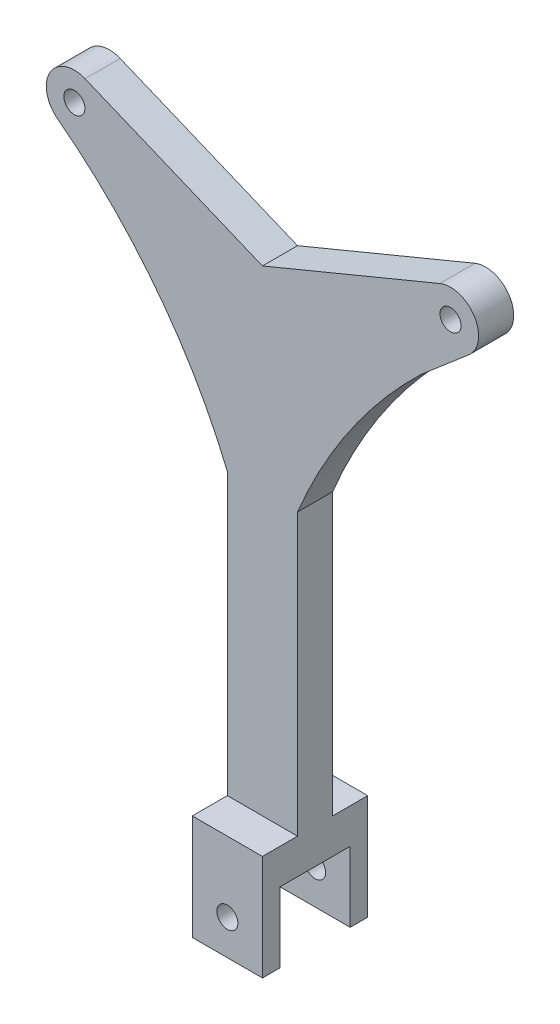
ISO-10303-21;
HEADER;
FILE_DESCRIPTION(('STEP AP214'),'2;1');
FILE_NAME('part.step','',(''),(''),'','','');
FILE_SCHEMA(('AUTOMOTIVE_DESIGN { 1 0 10303 214 1 1 1 1 }'));
ENDSEC;
DATA;
#1=APPLICATION_CONTEXT('core data for automotive mechanical design processes');
#2=APPLICATION_PROTOCOL_DEFINITION('international standard','automotive_design',2000,#1);
#3=PRODUCT_CONTEXT('',#1,'mechanical');
#4=PRODUCT('Part','Part','',(#3));
#5=PRODUCT_RELATED_PRODUCT_CATEGORY('part','',(#4));
#6=PRODUCT_DEFINITION_FORMATION('','',#4);
#7=PRODUCT_DEFINITION_CONTEXT('part definition',#1,'design');
#8=PRODUCT_DEFINITION('design','',#6,#7);
#9=PRODUCT_DEFINITION_SHAPE('','',#8);
#10=(LENGTH_UNIT() NAMED_UNIT(*) SI_UNIT(.MILLI.,.METRE.));
#11=(NAMED_UNIT(*) PLANE_ANGLE_UNIT() SI_UNIT($,.RADIAN.));
#12=(NAMED_UNIT(*) SI_UNIT($,.STERADIAN.) SOLID_ANGLE_UNIT());
#13=UNCERTAINTY_MEASURE_WITH_UNIT(LENGTH_MEASURE(1.E-05),#10,'distance_accuracy_value','');
#14=(GEOMETRIC_REPRESENTATION_CONTEXT(3) GLOBAL_UNCERTAINTY_ASSIGNED_CONTEXT((#13)) GLOBAL_UNIT_ASSIGNED_CONTEXT((#10,
#11,#12)) REPRESENTATION_CONTEXT('',''));
#15=CARTESIAN_POINT('',(0.,0.,0.));
#16=DIRECTION('',(0.,0.,1.));
#17=DIRECTION('',(1.,0.,0.));
#18=AXIS2_PLACEMENT_3D('',#15,#16,#17);
#19=CARTESIAN_POINT('',(0.,-78.5249310338471,0.));
#20=DIRECTION('',(0.,-1.,0.));
#21=DIRECTION('',(0.,0.,-1.));
#22=AXIS2_PLACEMENT_3D('',#19,#20,#21);
#23=PLANE('',#22);
#24=DIRECTION('',(1.,0.,0.));
#25=VECTOR('',#24,1.);
#26=CARTESIAN_POINT('',(-5.,-78.5249310338471,-5.));
#27=LINE('',#26,#25);
#28=CARTESIAN_POINT('',(-5.,-78.5249310338471,-5.));
#29=VERTEX_POINT('',#28);
#30=CARTESIAN_POINT('',(5.,-78.5249310338471,-5.));
#31=VERTEX_POINT('',#30);
#32=EDGE_CURVE('E382',#29,#31,#27,.T.);
#33=ORIENTED_EDGE('',*,*,#32,.F.);
#34=DIRECTION('',(0.,0.,-1.));
#35=VECTOR('',#34,1.);
#36=CARTESIAN_POINT('',(-5.00000000000007,-78.5249310338471,7.5));
#37=LINE('',#36,#35);
#38=CARTESIAN_POINT('',(-5.00000000000007,-78.5249310338471,-7.5));
#39=VERTEX_POINT('',#38);
#40=EDGE_CURVE('E403',#29,#39,#37,.T.);
#41=ORIENTED_EDGE('',*,*,#40,.T.);
#42=DIRECTION('',(1.,0.,0.));
#43=VECTOR('',#42,1.);
#44=CARTESIAN_POINT('',(-5.00000000000007,-78.5249310338471,-7.5));
#45=LINE('',#44,#43);
#46=CARTESIAN_POINT('',(5.00000000000007,-78.5249310338471,-7.5));
#47=VERTEX_POINT('',#46);
#48=EDGE_CURVE('E405',#39,#47,#45,.T.);
#49=ORIENTED_EDGE('',*,*,#48,.T.);
#50=DIRECTION('',(0.,0.,1.));
#51=VECTOR('',#50,1.);
#52=CARTESIAN_POINT('',(5.00000000000007,-78.5249310338471,7.5));
#53=LINE('',#52,#51);
#54=EDGE_CURVE('E392',#47,#31,#53,.T.);
#55=ORIENTED_EDGE('',*,*,#54,.T.);
#56=EDGE_LOOP('',(#33,#41,#49,#55));
#57=FACE_BOUND('',#56,.T.);
#58=ADVANCED_FACE('F136',(#57),#23,.T.);
#59=CARTESIAN_POINT('',(8.43595369184053,-9.86418299890832,2.5));
#60=DIRECTION('',(0.649944425817213,-0.759981738826094,0.));
#61=DIRECTION('',(0.759981738826094,0.649944425817213,0.));
#62=AXIS2_PLACEMENT_3D('',#59,#60,#61);
#63=PLANE('',#62);
#64=DIRECTION('',(-0.759981738826094,-0.649944425817213,0.));
#65=VECTOR('',#64,1.);
#66=CARTESIAN_POINT('',(8.43595369184053,-9.86418299890832,-2.5));
#67=LINE('',#66,#65);
#68=CARTESIAN_POINT('',(29.392284146096,8.05789258328351,-2.5));
#69=VERTEX_POINT('',#68);
#70=CARTESIAN_POINT('',(22.660097642879,2.30045544000895,-2.5));
#71=VERTEX_POINT('',#70);
#72=EDGE_CURVE('E257',#69,#71,#67,.T.);
#73=ORIENTED_EDGE('',*,*,#72,.F.);
#74=DIRECTION('',(0.,0.,-1.));
#75=VECTOR('',#74,1.);
#76=CARTESIAN_POINT('',(29.392284146096,8.05789258328351,2.5));
#77=LINE('',#76,#75);
#78=CARTESIAN_POINT('',(29.392284146096,8.05789258328351,2.5));
#79=VERTEX_POINT('',#78);
#80=EDGE_CURVE('E145',#79,#69,#77,.T.);
#81=ORIENTED_EDGE('',*,*,#80,.F.);
#82=DIRECTION('',(-0.759981738826094,-0.649944425817213,0.));
#83=VECTOR('',#82,1.);
#84=CARTESIAN_POINT('',(8.43595369184053,-9.86418299890832,2.5));
#85=LINE('',#84,#83);
#86=CARTESIAN_POINT('',(22.660097642879,2.30045544000895,2.5));
#87=VERTEX_POINT('',#86);
#88=EDGE_CURVE('E308',#79,#87,#85,.T.);
#89=ORIENTED_EDGE('',*,*,#88,.T.);
#90=DIRECTION('',(0.,0.,-1.));
#91=VECTOR('',#90,1.);
#92=CARTESIAN_POINT('',(22.660097642879,2.30045544000895,2.5));
#93=LINE('',#92,#91);
#94=EDGE_CURVE('E12',#87,#71,#93,.T.);
#95=ORIENTED_EDGE('',*,*,#94,.T.);
#96=EDGE_LOOP('',(#73,#81,#89,#95));
#97=FACE_BOUND('',#96,.T.);
#98=ADVANCED_FACE('F343',(#97),#63,.T.);
#99=CARTESIAN_POINT('',(26.7925064428273,11.0978195385877,2.5));
#100=DIRECTION('',(0.,0.,-1.));
#101=DIRECTION('',(-1.,0.,0.));
#102=AXIS2_PLACEMENT_3D('',#99,#100,#101);
#103=CYLINDRICAL_SURFACE('',#102,3.99999999999979);
#104=CARTESIAN_POINT('',(26.7925064428273,11.0978195385877,-2.5));
#105=DIRECTION('',(0.,0.,1.));
#106=DIRECTION('',(1.,0.,0.));
#107=AXIS2_PLACEMENT_3D('',#104,#105,#106);
#108=CIRCLE('',#107,3.99999999999979);
#109=CARTESIAN_POINT('',(25.2617727133674,14.7933376686328,-2.5));
#110=VERTEX_POINT('',#109);
#111=EDGE_CURVE('E261',#69,#110,#108,.T.);
#112=ORIENTED_EDGE('',*,*,#111,.T.);
#113=DIRECTION('',(0.,0.,-1.));
#114=VECTOR('',#113,1.);
#115=CARTESIAN_POINT('',(25.2617727133674,14.7933376686328,2.5));
#116=LINE('',#115,#114);
#117=CARTESIAN_POINT('',(25.2617727133674,14.7933376686328,2.5));
#118=VERTEX_POINT('',#117);
#119=EDGE_CURVE('E286',#118,#110,#116,.T.);
#120=ORIENTED_EDGE('',*,*,#119,.F.);
#121=CARTESIAN_POINT('',(26.7925064428273,11.0978195385877,2.5));
#122=DIRECTION('',(0.,0.,1.));
#123=DIRECTION('',(1.,0.,0.));
#124=AXIS2_PLACEMENT_3D('',#121,#122,#123);
#125=CIRCLE('',#124,3.99999999999979);
#126=EDGE_CURVE('E311',#79,#118,#125,.T.);
#127=ORIENTED_EDGE('',*,*,#126,.F.);
#128=ORIENTED_EDGE('',*,*,#80,.T.);
#129=EDGE_LOOP('',(#112,#120,#127,#128));
#130=FACE_BOUND('',#129,.T.);
#131=ADVANCED_FACE('F350',(#130),#103,.T.);
#132=CARTESIAN_POINT('',(-1.53073372946035,3.69551813004517,2.5));
#133=DIRECTION('',(0.382683432365086,-0.923879532511288,0.));
#134=DIRECTION('',(0.923879532511288,0.382683432365086,0.));
#135=AXIS2_PLACEMENT_3D('',#132,#133,#134);
#136=PLANE('',#135);
#137=DIRECTION('',(-0.923879532511288,-0.382683432365086,0.));
#138=VECTOR('',#137,1.);
#139=CARTESIAN_POINT('',(-1.53073372946035,3.69551813004517,-2.5));
#140=LINE('',#139,#138);
#141=CARTESIAN_POINT('',(0.,4.32956880116959,-2.5));
#142=VERTEX_POINT('',#141);
#143=EDGE_CURVE('E263',#110,#142,#140,.T.);
#144=ORIENTED_EDGE('',*,*,#143,.T.);
#145=DIRECTION('',(0.,0.,-1.));
#146=VECTOR('',#145,1.);
#147=CARTESIAN_POINT('',(0.,4.32956880116959,2.5));
#148=LINE('',#147,#146);
#149=CARTESIAN_POINT('',(0.,4.32956880116959,2.5));
#150=VERTEX_POINT('',#149);
#151=EDGE_CURVE('E284',#150,#142,#148,.T.);
#152=ORIENTED_EDGE('',*,*,#151,.F.);
#153=DIRECTION('',(-0.923879532511288,-0.382683432365086,0.));
#154=VECTOR('',#153,1.);
#155=CARTESIAN_POINT('',(-1.53073372946035,3.69551813004517,2.5));
#156=LINE('',#155,#154);
#157=EDGE_CURVE('E313',#118,#150,#156,.T.);
#158=ORIENTED_EDGE('',*,*,#157,.F.);
#159=ORIENTED_EDGE('',*,*,#119,.T.);
#160=EDGE_LOOP('',(#144,#152,#158,#159));
#161=FACE_BOUND('',#160,.T.);
#162=ADVANCED_FACE('F326',(#161),#136,.F.);
#163=CARTESIAN_POINT('',(1.53073372946035,3.69551813004517,2.5));
#164=DIRECTION('',(0.382683432365087,0.923879532511288,0.));
#165=DIRECTION('',(-0.923879532511288,0.382683432365087,0.));
#166=AXIS2_PLACEMENT_3D('',#163,#164,#165);
#167=PLANE('',#166);
#168=DIRECTION('',(0.923879532511288,-0.382683432365087,0.));
#169=VECTOR('',#168,1.);
#170=CARTESIAN_POINT('',(1.53073372946035,3.69551813004517,-2.5));
#171=LINE('',#170,#169);
#172=CARTESIAN_POINT('',(-25.2617727133674,14.7933376686328,-2.5));
#173=VERTEX_POINT('',#172);
#174=EDGE_CURVE('E266',#173,#142,#171,.T.);
#175=ORIENTED_EDGE('',*,*,#174,.F.);
#176=DIRECTION('',(0.,0.,-1.));
#177=VECTOR('',#176,1.);
#178=CARTESIAN_POINT('',(-25.2617727133674,14.7933376686328,2.5));
#179=LINE('',#178,#177);
#180=CARTESIAN_POINT('',(-25.2617727133674,14.7933376686328,2.5));
#181=VERTEX_POINT('',#180);
#182=EDGE_CURVE('E282',#181,#173,#179,.T.);
#183=ORIENTED_EDGE('',*,*,#182,.F.);
#184=DIRECTION('',(0.923879532511288,-0.382683432365087,0.));
#185=VECTOR('',#184,1.);
#186=CARTESIAN_POINT('',(1.53073372946035,3.69551813004517,2.5));
#187=LINE('',#186,#185);
#188=EDGE_CURVE('E315',#181,#150,#187,.T.);
#189=ORIENTED_EDGE('',*,*,#188,.T.);
#190=ORIENTED_EDGE('',*,*,#151,.T.);
#191=EDGE_LOOP('',(#175,#183,#189,#190));
#192=FACE_BOUND('',#191,.T.);
#193=ADVANCED_FACE('F319',(#192),#167,.T.);
#194=CARTESIAN_POINT('',(-26.7925064428273,11.0978195385875,2.5));
#195=DIRECTION('',(0.,0.,-1.));
#196=DIRECTION('',(-1.,0.,0.));
#197=AXIS2_PLACEMENT_3D('',#194,#195,#196);
#198=CYLINDRICAL_SURFACE('',#197,4.);
#199=CARTESIAN_POINT('',(-26.7925064428273,11.0978195385875,-2.5));
#200=DIRECTION('',(0.,0.,1.));
#201=DIRECTION('',(1.,0.,0.));
#202=AXIS2_PLACEMENT_3D('',#199,#200,#201);
#203=CIRCLE('',#202,4.);
#204=CARTESIAN_POINT('',(-29.3562914976841,8.02747652965627,-2.5));
#205=VERTEX_POINT('',#204);
#206=EDGE_CURVE('E269',#173,#205,#203,.T.);
#207=ORIENTED_EDGE('',*,*,#206,.T.);
#208=DIRECTION('',(0.,0.,-1.));
#209=VECTOR('',#208,1.);
#210=CARTESIAN_POINT('',(-29.3562914976841,8.02747652965627,2.5));
#211=LINE('',#210,#209);
#212=CARTESIAN_POINT('',(-29.3562914976841,8.02747652965627,2.5));
#213=VERTEX_POINT('',#212);
#214=EDGE_CURVE('E240',#213,#205,#211,.T.);
#215=ORIENTED_EDGE('',*,*,#214,.F.);
#216=CARTESIAN_POINT('',(-26.7925064428273,11.0978195385875,2.5));
#217=DIRECTION('',(0.,0.,1.));
#218=DIRECTION('',(1.,0.,0.));
#219=AXIS2_PLACEMENT_3D('',#216,#217,#218);
#220=CIRCLE('',#219,4.);
#221=EDGE_CURVE('E227',#181,#213,#220,.T.);
#222=ORIENTED_EDGE('',*,*,#221,.F.);
#223=ORIENTED_EDGE('',*,*,#182,.T.);
#224=EDGE_LOOP('',(#207,#215,#222,#223));
#225=FACE_BOUND('',#224,.T.);
#226=ADVANCED_FACE('F333',(#225),#198,.T.);
#227=CARTESIAN_POINT('',(-75.5569183222098,-52.8131299989289,2.5));
#228=DIRECTION('',(0.,0.,-1.));
#229=DIRECTION('',(-1.,0.,0.));
#230=AXIS2_PLACEMENT_3D('',#227,#228,#229);
#231=CYLINDRICAL_SURFACE('',#230,76.3942230914433);
#232=CARTESIAN_POINT('',(-75.5569183222098,-52.8131299989289,-2.5));
#233=DIRECTION('',(0.,0.,1.));
#234=DIRECTION('',(1.,0.,0.));
#235=AXIS2_PLACEMENT_3D('',#232,#233,#234);
#236=CIRCLE('',#235,76.3942230914433);
#237=CARTESIAN_POINT('',(-5.,-23.5249310338471,-2.5));
#238=VERTEX_POINT('',#237);
#239=EDGE_CURVE('E236',#205,#238,#236,.F.);
#240=ORIENTED_EDGE('',*,*,#239,.T.);
#241=DIRECTION('',(0.,0.,-1.));
#242=VECTOR('',#241,1.);
#243=CARTESIAN_POINT('',(-5.,-23.5249310338471,2.5));
#244=LINE('',#243,#242);
#245=CARTESIAN_POINT('',(-5.,-23.5249310338471,2.5));
#246=VERTEX_POINT('',#245);
#247=EDGE_CURVE('E233',#246,#238,#244,.T.);
#248=ORIENTED_EDGE('',*,*,#247,.F.);
#249=CARTESIAN_POINT('',(-75.5569183222098,-52.8131299989289,2.5));
#250=DIRECTION('',(0.,0.,1.));
#251=DIRECTION('',(1.,0.,0.));
#252=AXIS2_PLACEMENT_3D('',#249,#250,#251);
#253=CIRCLE('',#252,76.3942230914433);
#254=EDGE_CURVE('E219',#213,#246,#253,.F.);
#255=ORIENTED_EDGE('',*,*,#254,.F.);
#256=ORIENTED_EDGE('',*,*,#214,.T.);
#257=EDGE_LOOP('',(#240,#248,#255,#256));
#258=FACE_BOUND('',#257,.T.);
#259=ADVANCED_FACE('F234',(#258),#231,.F.);
#260=CARTESIAN_POINT('',(-5.00000000000009,0.,2.5));
#261=DIRECTION('',(-1.,0.,0.));
#262=DIRECTION('',(0.,-1.,0.));
#263=AXIS2_PLACEMENT_3D('',#260,#261,#262);
#264=PLANE('',#263);
#265=DIRECTION('',(0.,-1.,0.));
#266=VECTOR('',#265,1.);
#267=CARTESIAN_POINT('',(-5.,-68.5249310338471,-5.));
#268=LINE('',#267,#266);
#269=CARTESIAN_POINT('',(-5.,-68.5249310338471,-5.));
#270=VERTEX_POINT('',#269);
#271=EDGE_CURVE('E498',#270,#29,#268,.T.);
#272=ORIENTED_EDGE('',*,*,#271,.F.);
#273=DIRECTION('',(0.,0.,-1.));
#274=VECTOR('',#273,1.);
#275=CARTESIAN_POINT('',(-5.,-68.5249310338471,5.));
#276=LINE('',#275,#274);
#277=CARTESIAN_POINT('',(-5.,-68.5249310338471,5.));
#278=VERTEX_POINT('',#277);
#279=EDGE_CURVE('E482',#278,#270,#276,.T.);
#280=ORIENTED_EDGE('',*,*,#279,.F.);
#281=DIRECTION('',(0.,-1.,0.));
#282=VECTOR('',#281,1.);
#283=CARTESIAN_POINT('',(-5.,-68.5249310338471,5.));
#284=LINE('',#283,#282);
#285=CARTESIAN_POINT('',(-5.,-78.5249310338471,5.));
#286=VERTEX_POINT('',#285);
#287=EDGE_CURVE('E479',#278,#286,#284,.T.);
#288=ORIENTED_EDGE('',*,*,#287,.T.);
#289=CARTESIAN_POINT('',(-5.00000000000007,-78.5249310338471,7.5));
#290=VERTEX_POINT('',#289);
#291=EDGE_CURVE('E379',#290,#286,#37,.T.);
#292=ORIENTED_EDGE('',*,*,#291,.F.);
#293=DIRECTION('',(0.,1.,0.));
#294=VECTOR('',#293,1.);
#295=CARTESIAN_POINT('',(-5.00000000000007,-78.5249310338471,7.5));
#296=LINE('',#295,#294);
#297=CARTESIAN_POINT('',(-5.00000000000007,-63.5249310338471,7.5));
#298=VERTEX_POINT('',#297);
#299=EDGE_CURVE('E422',#290,#298,#296,.T.);
#300=ORIENTED_EDGE('',*,*,#299,.T.);
#301=DIRECTION('',(0.,0.,-1.));
#302=VECTOR('',#301,1.);
#303=CARTESIAN_POINT('',(-5.00000000000007,-63.5249310338471,7.5));
#304=LINE('',#303,#302);
#305=CARTESIAN_POINT('',(-5.00000000000007,-63.5249310338471,2.5));
#306=VERTEX_POINT('',#305);
#307=EDGE_CURVE('E247',#298,#306,#304,.T.);
#308=ORIENTED_EDGE('',*,*,#307,.T.);
#309=DIRECTION('',(0.,1.,0.));
#310=VECTOR('',#309,1.);
#311=CARTESIAN_POINT('',(-5.00000000000009,0.,2.5));
#312=LINE('',#311,#310);
#313=EDGE_CURVE('E224',#306,#246,#312,.T.);
#314=ORIENTED_EDGE('',*,*,#313,.T.);
#315=ORIENTED_EDGE('',*,*,#247,.T.);
#316=DIRECTION('',(0.,1.,0.));
#317=VECTOR('',#316,1.);
#318=CARTESIAN_POINT('',(-5.00000000000009,0.,-2.5));
#319=LINE('',#318,#317);
#320=CARTESIAN_POINT('',(-5.00000000000007,-63.5249310338471,-2.5));
#321=VERTEX_POINT('',#320);
#322=EDGE_CURVE('E272',#321,#238,#319,.T.);
#323=ORIENTED_EDGE('',*,*,#322,.F.);
#324=CARTESIAN_POINT('',(-5.00000000000007,-63.5249310338471,-7.5));
#325=VERTEX_POINT('',#324);
#326=EDGE_CURVE('E416',#321,#325,#304,.T.);
#327=ORIENTED_EDGE('',*,*,#326,.T.);
#328=DIRECTION('',(0.,1.,0.));
#329=VECTOR('',#328,1.);
#330=CARTESIAN_POINT('',(-5.00000000000007,-78.5249310338471,-7.5));
#331=LINE('',#330,#329);
#332=EDGE_CURVE('E420',#39,#325,#331,.T.);
#333=ORIENTED_EDGE('',*,*,#332,.F.);
#334=ORIENTED_EDGE('',*,*,#40,.F.);
#335=EDGE_LOOP('',(#272,#280,#288,#292,#300,#308,#314,#315,#323,#327,#333,#334));
#336=FACE_BOUND('',#335,.T.);
#337=ADVANCED_FACE('F244',(#336),#264,.T.);
#338=CARTESIAN_POINT('',(4.99999999999992,0.,2.5));
#339=DIRECTION('',(-1.,0.,0.));
#340=DIRECTION('',(0.,-1.,0.));
#341=AXIS2_PLACEMENT_3D('',#338,#339,#340);
#342=PLANE('',#341);
#343=DIRECTION('',(0.,0.,1.));
#344=VECTOR('',#343,1.);
#345=CARTESIAN_POINT('',(5.,-68.5249310338471,5.));
#346=LINE('',#345,#344);
#347=CARTESIAN_POINT('',(5.,-68.5249310338471,-5.));
#348=VERTEX_POINT('',#347);
#349=CARTESIAN_POINT('',(5.,-68.5249310338471,5.));
#350=VERTEX_POINT('',#349);
#351=EDGE_CURVE('E483',#348,#350,#346,.T.);
#352=ORIENTED_EDGE('',*,*,#351,.F.);
#353=DIRECTION('',(0.,-1.,0.));
#354=VECTOR('',#353,1.);
#355=CARTESIAN_POINT('',(5.,-68.5249310338471,-5.));
#356=LINE('',#355,#354);
#357=EDGE_CURVE('E496',#348,#31,#356,.T.);
#358=ORIENTED_EDGE('',*,*,#357,.T.);
#359=ORIENTED_EDGE('',*,*,#54,.F.);
#360=DIRECTION('',(0.,1.,0.));
#361=VECTOR('',#360,1.);
#362=CARTESIAN_POINT('',(5.00000000000007,-78.5249310338471,-7.5));
#363=LINE('',#362,#361);
#364=CARTESIAN_POINT('',(5.00000000000007,-63.5249310338471,-7.5));
#365=VERTEX_POINT('',#364);
#366=EDGE_CURVE('E408',#47,#365,#363,.T.);
#367=ORIENTED_EDGE('',*,*,#366,.T.);
#368=DIRECTION('',(0.,0.,1.));
#369=VECTOR('',#368,1.);
#370=CARTESIAN_POINT('',(5.00000000000007,-63.5249310338471,7.5));
#371=LINE('',#370,#369);
#372=CARTESIAN_POINT('',(5.00000000000007,-63.5249310338471,-2.5));
#373=VERTEX_POINT('',#372);
#374=EDGE_CURVE('E409',#365,#373,#371,.T.);
#375=ORIENTED_EDGE('',*,*,#374,.T.);
#376=DIRECTION('',(0.,1.,0.));
#377=VECTOR('',#376,1.);
#378=CARTESIAN_POINT('',(4.99999999999992,0.,-2.5));
#379=LINE('',#378,#377);
#380=CARTESIAN_POINT('',(5.,-23.5249310338466,-2.5));
#381=VERTEX_POINT('',#380);
#382=EDGE_CURVE('E277',#373,#381,#379,.T.);
#383=ORIENTED_EDGE('',*,*,#382,.T.);
#384=DIRECTION('',(0.,0.,-1.));
#385=VECTOR('',#384,1.);
#386=CARTESIAN_POINT('',(5.,-23.5249310338466,2.5));
#387=LINE('',#386,#385);
#388=CARTESIAN_POINT('',(5.,-23.5249310338466,2.5));
#389=VERTEX_POINT('',#388);
#390=EDGE_CURVE('E195',#389,#381,#387,.T.);
#391=ORIENTED_EDGE('',*,*,#390,.F.);
#392=DIRECTION('',(0.,1.,0.));
#393=VECTOR('',#392,1.);
#394=CARTESIAN_POINT('',(4.99999999999992,0.,2.5));
#395=LINE('',#394,#393);
#396=CARTESIAN_POINT('',(5.00000000000014,-63.5249310338471,2.5));
#397=VERTEX_POINT('',#396);
#398=EDGE_CURVE('E162',#397,#389,#395,.T.);
#399=ORIENTED_EDGE('',*,*,#398,.F.);
#400=CARTESIAN_POINT('',(5.00000000000007,-63.5249310338471,7.5));
#401=VERTEX_POINT('',#400);
#402=EDGE_CURVE('E413',#397,#401,#371,.T.);
#403=ORIENTED_EDGE('',*,*,#402,.T.);
#404=DIRECTION('',(0.,1.,0.));
#405=VECTOR('',#404,1.);
#406=CARTESIAN_POINT('',(5.00000000000007,-78.5249310338471,7.5));
#407=LINE('',#406,#405);
#408=CARTESIAN_POINT('',(5.00000000000007,-78.5249310338471,7.5));
#409=VERTEX_POINT('',#408);
#410=EDGE_CURVE('E293',#409,#401,#407,.T.);
#411=ORIENTED_EDGE('',*,*,#410,.F.);
#412=CARTESIAN_POINT('',(5.00000000000007,-78.5249310338471,5.));
#413=VERTEX_POINT('',#412);
#414=EDGE_CURVE('E375',#413,#409,#53,.T.);
#415=ORIENTED_EDGE('',*,*,#414,.F.);
#416=DIRECTION('',(0.,-1.,0.));
#417=VECTOR('',#416,1.);
#418=CARTESIAN_POINT('',(5.,-68.5249310338471,5.));
#419=LINE('',#418,#417);
#420=EDGE_CURVE('E153',#350,#413,#419,.T.);
#421=ORIENTED_EDGE('',*,*,#420,.F.);
#422=EDGE_LOOP('',(#352,#358,#359,#367,#375,#383,#391,#399,#403,#411,#415,#421));
#423=FACE_BOUND('',#422,.T.);
#424=ADVANCED_FACE('F388',(#423),#342,.F.);
#425=CARTESIAN_POINT('',(75.5538107019638,-52.820615309464,2.5));
#426=DIRECTION('',(0.,0.,-1.));
#427=DIRECTION('',(-1.,0.,0.));
#428=AXIS2_PLACEMENT_3D('',#425,#426,#427);
#429=CYLINDRICAL_SURFACE('',#428,76.3942230914433);
#430=CARTESIAN_POINT('',(75.5538107019638,-52.820615309464,-2.5));
#431=DIRECTION('',(0.,0.,1.));
#432=DIRECTION('',(1.,0.,0.));
#433=AXIS2_PLACEMENT_3D('',#430,#431,#432);
#434=CIRCLE('',#433,76.3942230914433);
#435=EDGE_CURVE('E254',#71,#381,#434,.T.);
#436=ORIENTED_EDGE('',*,*,#435,.F.);
#437=ORIENTED_EDGE('',*,*,#94,.F.);
#438=CARTESIAN_POINT('',(75.5538107019638,-52.820615309464,2.5));
#439=DIRECTION('',(0.,0.,1.));
#440=DIRECTION('',(1.,0.,0.));
#441=AXIS2_PLACEMENT_3D('',#438,#439,#440);
#442=CIRCLE('',#441,76.3942230914433);
#443=EDGE_CURVE('E279',#87,#389,#442,.T.);
#444=ORIENTED_EDGE('',*,*,#443,.T.);
#445=ORIENTED_EDGE('',*,*,#390,.T.);
#446=EDGE_LOOP('',(#436,#437,#444,#445));
#447=FACE_BOUND('',#446,.T.);
#448=ADVANCED_FACE('F138',(#447),#429,.F.);
#449=CARTESIAN_POINT('',(0.,0.,-2.5));
#450=DIRECTION('',(0.,0.,1.));
#451=DIRECTION('',(1.,0.,0.));
#452=AXIS2_PLACEMENT_3D('',#449,#450,#451);
#453=PLANE('',#452);
#454=CARTESIAN_POINT('',(-26.7925064428273,11.0978195385875,-2.5));
#455=DIRECTION('',(0.,0.,1.));
#456=DIRECTION('',(1.,0.,0.));
#457=AXIS2_PLACEMENT_3D('',#454,#455,#456);
#458=CIRCLE('',#457,1.5);
#459=CARTESIAN_POINT('',(-25.2925064428273,11.0978195385875,-2.5));
#460=VERTEX_POINT('',#459);
#461=EDGE_CURVE('E258',#460,#460,#458,.T.);
#462=ORIENTED_EDGE('',*,*,#461,.T.);
#463=EDGE_LOOP('',(#462));
#464=FACE_BOUND('',#463,.T.);
#465=CARTESIAN_POINT('',(26.7925064428273,11.0978195385877,-2.5));
#466=DIRECTION('',(0.,0.,1.));
#467=DIRECTION('',(1.,0.,0.));
#468=AXIS2_PLACEMENT_3D('',#465,#466,#467);
#469=CIRCLE('',#468,1.5);
#470=CARTESIAN_POINT('',(28.2925064428273,11.0978195385877,-2.5));
#471=VERTEX_POINT('',#470);
#472=EDGE_CURVE('E292',#471,#471,#469,.T.);
#473=ORIENTED_EDGE('',*,*,#472,.T.);
#474=EDGE_LOOP('',(#473));
#475=FACE_BOUND('',#474,.T.);
#476=ORIENTED_EDGE('',*,*,#435,.T.);
#477=ORIENTED_EDGE('',*,*,#382,.F.);
#478=DIRECTION('',(1.,0.,0.));
#479=VECTOR('',#478,1.);
#480=CARTESIAN_POINT('',(0.,-63.5249310338471,-2.5));
#481=LINE('',#480,#479);
#482=EDGE_CURVE('E274',#321,#373,#481,.T.);
#483=ORIENTED_EDGE('',*,*,#482,.F.);
#484=ORIENTED_EDGE('',*,*,#322,.T.);
#485=ORIENTED_EDGE('',*,*,#239,.F.);
#486=ORIENTED_EDGE('',*,*,#206,.F.);
#487=ORIENTED_EDGE('',*,*,#174,.T.);
#488=ORIENTED_EDGE('',*,*,#143,.F.);
#489=ORIENTED_EDGE('',*,*,#111,.F.);
#490=ORIENTED_EDGE('',*,*,#72,.T.);
#491=EDGE_LOOP('',(#476,#477,#483,#484,#485,#486,#487,#488,#489,#490));
#492=FACE_BOUND('',#491,.T.);
#493=ADVANCED_FACE('F331',(#464,#475,#492),#453,.F.);
#494=CARTESIAN_POINT('',(0.,0.,2.5));
#495=DIRECTION('',(0.,0.,1.));
#496=DIRECTION('',(1.,0.,0.));
#497=AXIS2_PLACEMENT_3D('',#494,#495,#496);
#498=PLANE('',#497);
#499=CARTESIAN_POINT('',(-26.7925064428273,11.0978195385875,2.5));
#500=DIRECTION('',(0.,0.,1.));
#501=DIRECTION('',(1.,0.,0.));
#502=AXIS2_PLACEMENT_3D('',#499,#500,#501);
#503=CIRCLE('',#502,1.5);
#504=CARTESIAN_POINT('',(-25.2925064428273,11.0978195385875,2.5));
#505=VERTEX_POINT('',#504);
#506=EDGE_CURVE('E294',#505,#505,#503,.T.);
#507=ORIENTED_EDGE('',*,*,#506,.F.);
#508=EDGE_LOOP('',(#507));
#509=FACE_BOUND('',#508,.T.);
#510=CARTESIAN_POINT('',(26.7925064428273,11.0978195385877,2.5));
#511=DIRECTION('',(0.,0.,1.));
#512=DIRECTION('',(1.,0.,0.));
#513=AXIS2_PLACEMENT_3D('',#510,#511,#512);
#514=CIRCLE('',#513,1.5);
#515=CARTESIAN_POINT('',(28.2925064428273,11.0978195385877,2.5));
#516=VERTEX_POINT('',#515);
#517=EDGE_CURVE('E290',#516,#516,#514,.T.);
#518=ORIENTED_EDGE('',*,*,#517,.F.);
#519=EDGE_LOOP('',(#518));
#520=FACE_BOUND('',#519,.T.);
#521=ORIENTED_EDGE('',*,*,#443,.F.);
#522=ORIENTED_EDGE('',*,*,#88,.F.);
#523=ORIENTED_EDGE('',*,*,#126,.T.);
#524=ORIENTED_EDGE('',*,*,#157,.T.);
#525=ORIENTED_EDGE('',*,*,#188,.F.);
#526=ORIENTED_EDGE('',*,*,#221,.T.);
#527=ORIENTED_EDGE('',*,*,#254,.T.);
#528=ORIENTED_EDGE('',*,*,#313,.F.);
#529=DIRECTION('',(1.,0.,0.));
#530=VECTOR('',#529,1.);
#531=CARTESIAN_POINT('',(0.,-63.5249310338471,2.5));
#532=LINE('',#531,#530);
#533=EDGE_CURVE('E248',#306,#397,#532,.T.);
#534=ORIENTED_EDGE('',*,*,#533,.T.);
#535=ORIENTED_EDGE('',*,*,#398,.T.);
#536=EDGE_LOOP('',(#521,#522,#523,#524,#525,#526,#527,#528,#534,#535));
#537=FACE_BOUND('',#536,.T.);
#538=ADVANCED_FACE('F221',(#509,#520,#537),#498,.T.);
#539=CARTESIAN_POINT('',(26.7925064428273,11.0978195385877,-8.5));
#540=DIRECTION('',(0.,0.,1.));
#541=DIRECTION('',(1.,0.,0.));
#542=AXIS2_PLACEMENT_3D('',#539,#540,#541);
#543=CYLINDRICAL_SURFACE('',#542,1.5);
#544=ORIENTED_EDGE('',*,*,#517,.T.);
#545=EDGE_LOOP('',(#544));
#546=FACE_BOUND('',#545,.T.);
#547=ORIENTED_EDGE('',*,*,#472,.F.);
#548=EDGE_LOOP('',(#547));
#549=FACE_BOUND('',#548,.T.);
#550=ADVANCED_FACE('F540',(#546,#549),#543,.F.);
#551=CARTESIAN_POINT('',(-26.7925064428273,11.0978195385875,-8.5));
#552=DIRECTION('',(0.,0.,1.));
#553=DIRECTION('',(1.,0.,0.));
#554=AXIS2_PLACEMENT_3D('',#551,#552,#553);
#555=CYLINDRICAL_SURFACE('',#554,1.5);
#556=ORIENTED_EDGE('',*,*,#506,.T.);
#557=EDGE_LOOP('',(#556));
#558=FACE_BOUND('',#557,.T.);
#559=ORIENTED_EDGE('',*,*,#461,.F.);
#560=EDGE_LOOP('',(#559));
#561=FACE_BOUND('',#560,.T.);
#562=ADVANCED_FACE('F536',(#558,#561),#555,.F.);
#563=CARTESIAN_POINT('',(0.,-63.5249310338471,0.));
#564=DIRECTION('',(0.,-1.,0.));
#565=DIRECTION('',(0.,0.,-1.));
#566=AXIS2_PLACEMENT_3D('',#563,#564,#565);
#567=PLANE('',#566);
#568=ORIENTED_EDGE('',*,*,#326,.F.);
#569=ORIENTED_EDGE('',*,*,#482,.T.);
#570=ORIENTED_EDGE('',*,*,#374,.F.);
#571=DIRECTION('',(1.,0.,0.));
#572=VECTOR('',#571,1.);
#573=CARTESIAN_POINT('',(-5.00000000000007,-63.5249310338471,-7.5));
#574=LINE('',#573,#572);
#575=EDGE_CURVE('E393',#325,#365,#574,.T.);
#576=ORIENTED_EDGE('',*,*,#575,.F.);
#577=EDGE_LOOP('',(#568,#569,#570,#576));
#578=FACE_BOUND('',#577,.T.);
#579=ADVANCED_FACE('F365',(#578),#567,.F.);
#580=CARTESIAN_POINT('',(-5.00000000000007,-78.5249310338471,7.5));
#581=DIRECTION('',(0.,0.,-1.));
#582=DIRECTION('',(-1.,0.,0.));
#583=AXIS2_PLACEMENT_3D('',#580,#581,#582);
#584=PLANE('',#583);
#585=CARTESIAN_POINT('',(0.,-73.5249310338471,7.5));
#586=DIRECTION('',(0.,0.,1.));
#587=DIRECTION('',(1.,0.,0.));
#588=AXIS2_PLACEMENT_3D('',#585,#586,#587);
#589=CIRCLE('',#588,1.5);
#590=CARTESIAN_POINT('',(1.5,-73.5249310338471,7.5));
#591=VERTEX_POINT('',#590);
#592=EDGE_CURVE('E525',#591,#591,#589,.T.);
#593=ORIENTED_EDGE('',*,*,#592,.F.);
#594=EDGE_LOOP('',(#593));
#595=FACE_BOUND('',#594,.T.);
#596=DIRECTION('',(-1.,0.,0.));
#597=VECTOR('',#596,1.);
#598=CARTESIAN_POINT('',(-5.00000000000007,-63.5249310338471,7.5));
#599=LINE('',#598,#597);
#600=EDGE_CURVE('E412',#401,#298,#599,.T.);
#601=ORIENTED_EDGE('',*,*,#600,.T.);
#602=ORIENTED_EDGE('',*,*,#299,.F.);
#603=DIRECTION('',(-1.,0.,0.));
#604=VECTOR('',#603,1.);
#605=CARTESIAN_POINT('',(-5.00000000000007,-78.5249310338471,7.5));
#606=LINE('',#605,#604);
#607=EDGE_CURVE('E396',#409,#290,#606,.T.);
#608=ORIENTED_EDGE('',*,*,#607,.F.);
#609=ORIENTED_EDGE('',*,*,#410,.T.);
#610=EDGE_LOOP('',(#601,#602,#608,#609));
#611=FACE_BOUND('',#610,.T.);
#612=ADVANCED_FACE('F366',(#595,#611),#584,.F.);
#613=CARTESIAN_POINT('',(-5.00000000000007,-78.5249310338471,-7.5));
#614=DIRECTION('',(0.,0.,1.));
#615=DIRECTION('',(1.,0.,0.));
#616=AXIS2_PLACEMENT_3D('',#613,#614,#615);
#617=PLANE('',#616);
#618=CARTESIAN_POINT('',(0.,-73.5249310338471,-7.5));
#619=DIRECTION('',(0.,0.,1.));
#620=DIRECTION('',(1.,0.,0.));
#621=AXIS2_PLACEMENT_3D('',#618,#619,#620);
#622=CIRCLE('',#621,1.5);
#623=CARTESIAN_POINT('',(1.5,-73.5249310338471,-7.5));
#624=VERTEX_POINT('',#623);
#625=EDGE_CURVE('E383',#624,#624,#622,.T.);
#626=ORIENTED_EDGE('',*,*,#625,.T.);
#627=EDGE_LOOP('',(#626));
#628=FACE_BOUND('',#627,.T.);
#629=ORIENTED_EDGE('',*,*,#575,.T.);
#630=ORIENTED_EDGE('',*,*,#366,.F.);
#631=ORIENTED_EDGE('',*,*,#48,.F.);
#632=ORIENTED_EDGE('',*,*,#332,.T.);
#633=EDGE_LOOP('',(#629,#630,#631,#632));
#634=FACE_BOUND('',#633,.T.);
#635=ADVANCED_FACE('F357',(#628,#634),#617,.F.);
#636=DIRECTION('',(-1.,0.,0.));
#637=VECTOR('',#636,1.);
#638=CARTESIAN_POINT('',(-5.,-78.5249310338471,5.));
#639=LINE('',#638,#637);
#640=EDGE_CURVE('E371',#413,#286,#639,.T.);
#641=ORIENTED_EDGE('',*,*,#640,.F.);
#642=ORIENTED_EDGE('',*,*,#414,.T.);
#643=ORIENTED_EDGE('',*,*,#607,.T.);
#644=ORIENTED_EDGE('',*,*,#291,.T.);
#645=EDGE_LOOP('',(#641,#642,#643,#644));
#646=FACE_BOUND('',#645,.T.);
#647=ADVANCED_FACE('F346',(#646),#23,.T.);
#648=ORIENTED_EDGE('',*,*,#533,.F.);
#649=ORIENTED_EDGE('',*,*,#307,.F.);
#650=ORIENTED_EDGE('',*,*,#600,.F.);
#651=ORIENTED_EDGE('',*,*,#402,.F.);
#652=EDGE_LOOP('',(#648,#649,#650,#651));
#653=FACE_BOUND('',#652,.T.);
#654=ADVANCED_FACE('F356',(#653),#567,.F.);
#655=CARTESIAN_POINT('',(-5.,-68.5249310338471,-5.));
#656=DIRECTION('',(0.,0.,-1.));
#657=DIRECTION('',(-1.,0.,0.));
#658=AXIS2_PLACEMENT_3D('',#655,#656,#657);
#659=PLANE('',#658);
#660=CARTESIAN_POINT('',(0.,-73.5249310338471,-5.));
#661=DIRECTION('',(0.,0.,-1.));
#662=DIRECTION('',(-1.,0.,0.));
#663=AXIS2_PLACEMENT_3D('',#660,#661,#662);
#664=CIRCLE('',#663,1.5);
#665=CARTESIAN_POINT('',(-1.5,-73.5249310338471,-5.));
#666=VERTEX_POINT('',#665);
#667=EDGE_CURVE('E521',#666,#666,#664,.T.);
#668=ORIENTED_EDGE('',*,*,#667,.T.);
#669=EDGE_LOOP('',(#668));
#670=FACE_BOUND('',#669,.T.);
#671=ORIENTED_EDGE('',*,*,#32,.T.);
#672=ORIENTED_EDGE('',*,*,#357,.F.);
#673=DIRECTION('',(1.,0.,0.));
#674=VECTOR('',#673,1.);
#675=CARTESIAN_POINT('',(-5.,-68.5249310338471,-5.));
#676=LINE('',#675,#674);
#677=EDGE_CURVE('E488',#270,#348,#676,.T.);
#678=ORIENTED_EDGE('',*,*,#677,.F.);
#679=ORIENTED_EDGE('',*,*,#271,.T.);
#680=EDGE_LOOP('',(#671,#672,#678,#679));
#681=FACE_BOUND('',#680,.T.);
#682=ADVANCED_FACE('F363',(#670,#681),#659,.F.);
#683=CARTESIAN_POINT('',(-5.,-68.5249310338471,5.));
#684=DIRECTION('',(0.,0.,1.));
#685=DIRECTION('',(1.,0.,0.));
#686=AXIS2_PLACEMENT_3D('',#683,#684,#685);
#687=PLANE('',#686);
#688=CARTESIAN_POINT('',(0.,-73.5249310338471,5.));
#689=DIRECTION('',(0.,0.,1.));
#690=DIRECTION('',(1.,0.,0.));
#691=AXIS2_PLACEMENT_3D('',#688,#689,#690);
#692=CIRCLE('',#691,1.5);
#693=CARTESIAN_POINT('',(1.5,-73.5249310338471,5.));
#694=VERTEX_POINT('',#693);
#695=EDGE_CURVE('E140',#694,#694,#692,.T.);
#696=ORIENTED_EDGE('',*,*,#695,.T.);
#697=EDGE_LOOP('',(#696));
#698=FACE_BOUND('',#697,.T.);
#699=ORIENTED_EDGE('',*,*,#640,.T.);
#700=ORIENTED_EDGE('',*,*,#287,.F.);
#701=DIRECTION('',(-1.,0.,0.));
#702=VECTOR('',#701,1.);
#703=CARTESIAN_POINT('',(-5.,-68.5249310338471,5.));
#704=LINE('',#703,#702);
#705=EDGE_CURVE('E476',#350,#278,#704,.T.);
#706=ORIENTED_EDGE('',*,*,#705,.F.);
#707=ORIENTED_EDGE('',*,*,#420,.T.);
#708=EDGE_LOOP('',(#699,#700,#706,#707));
#709=FACE_BOUND('',#708,.T.);
#710=ADVANCED_FACE('F478',(#698,#709),#687,.F.);
#711=CARTESIAN_POINT('',(0.,-68.5249310338471,0.));
#712=DIRECTION('',(0.,-1.,0.));
#713=DIRECTION('',(0.,0.,-1.));
#714=AXIS2_PLACEMENT_3D('',#711,#712,#713);
#715=PLANE('',#714);
#716=ORIENTED_EDGE('',*,*,#351,.T.);
#717=ORIENTED_EDGE('',*,*,#705,.T.);
#718=ORIENTED_EDGE('',*,*,#279,.T.);
#719=ORIENTED_EDGE('',*,*,#677,.T.);
#720=EDGE_LOOP('',(#716,#717,#718,#719));
#721=FACE_BOUND('',#720,.T.);
#722=ADVANCED_FACE('F486',(#721),#715,.T.);
#723=CARTESIAN_POINT('',(0.,-73.5249310338471,-10.5));
#724=DIRECTION('',(0.,0.,1.));
#725=DIRECTION('',(1.,0.,0.));
#726=AXIS2_PLACEMENT_3D('',#723,#724,#725);
#727=CYLINDRICAL_SURFACE('',#726,1.5);
#728=ORIENTED_EDGE('',*,*,#592,.T.);
#729=EDGE_LOOP('',(#728));
#730=FACE_BOUND('',#729,.T.);
#731=ORIENTED_EDGE('',*,*,#695,.F.);
#732=EDGE_LOOP('',(#731));
#733=FACE_BOUND('',#732,.T.);
#734=ADVANCED_FACE('F511',(#730,#733),#727,.F.);
#735=ORIENTED_EDGE('',*,*,#667,.F.);
#736=EDGE_LOOP('',(#735));
#737=FACE_BOUND('',#736,.T.);
#738=ORIENTED_EDGE('',*,*,#625,.F.);
#739=EDGE_LOOP('',(#738));
#740=FACE_BOUND('',#739,.T.);
#741=ADVANCED_FACE('F512',(#737,#740),#727,.F.);
#742=CLOSED_SHELL('',(#58,#98,#131,#162,#193,#226,#259,#337,#424,#448,#493,#538,#550,#562,#579,
#612,#635,#647,#654,#682,#710,#722,#734,#741));
#743=MANIFOLD_SOLID_BREP('B2',#742);
#744=ADVANCED_BREP_SHAPE_REPRESENTATION('',(#18,#743),#14);
#745=SHAPE_DEFINITION_REPRESENTATION(#9,#744);
ENDSEC;
END-ISO-10303-21;
